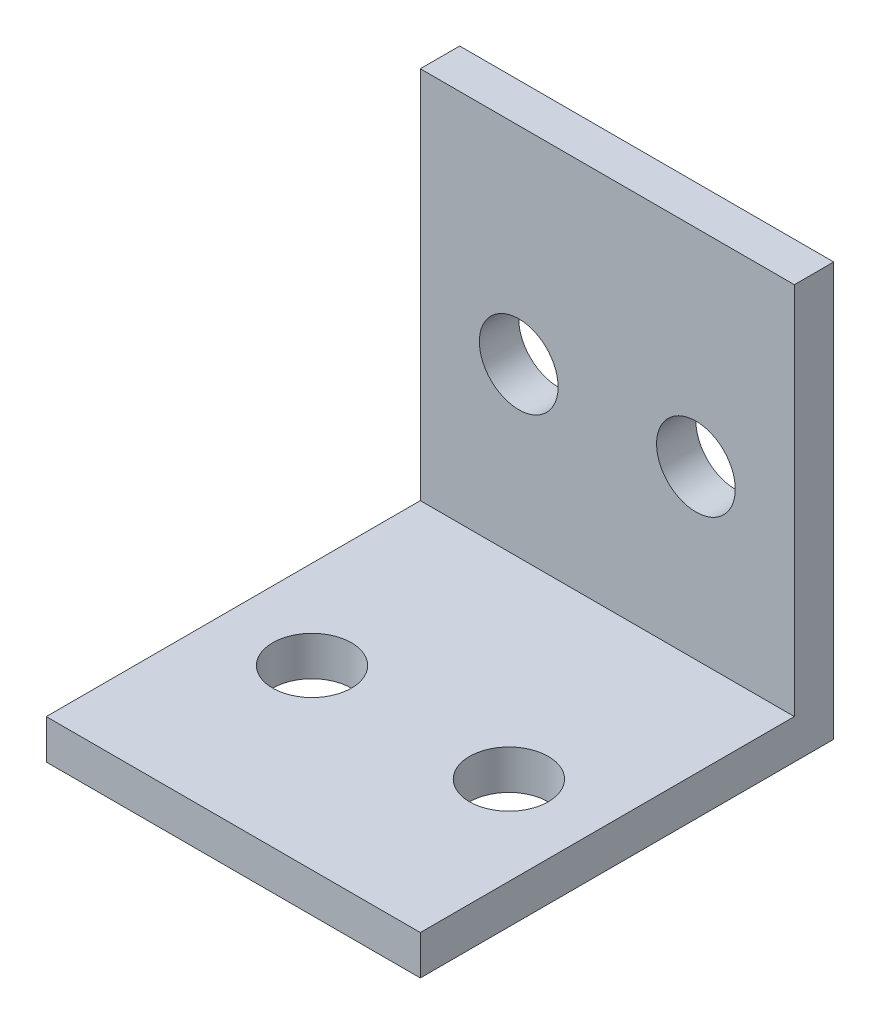
ISO-10303-21;
HEADER;
FILE_DESCRIPTION(('STEP AP214'),'2;1');
FILE_NAME('part.step','',(''),(''),'','','');
FILE_SCHEMA(('AUTOMOTIVE_DESIGN { 1 0 10303 214 1 1 1 1 }'));
ENDSEC;
DATA;
#1=APPLICATION_CONTEXT('core data for automotive mechanical design processes');
#2=APPLICATION_PROTOCOL_DEFINITION('international standard','automotive_design',2000,#1);
#3=PRODUCT_CONTEXT('',#1,'mechanical');
#4=PRODUCT('Part','Part','',(#3));
#5=PRODUCT_RELATED_PRODUCT_CATEGORY('part','',(#4));
#6=PRODUCT_DEFINITION_FORMATION('','',#4);
#7=PRODUCT_DEFINITION_CONTEXT('part definition',#1,'design');
#8=PRODUCT_DEFINITION('design','',#6,#7);
#9=PRODUCT_DEFINITION_SHAPE('','',#8);
#10=(LENGTH_UNIT() NAMED_UNIT(*) SI_UNIT(.MILLI.,.METRE.));
#11=(NAMED_UNIT(*) PLANE_ANGLE_UNIT() SI_UNIT($,.RADIAN.));
#12=(NAMED_UNIT(*) SI_UNIT($,.STERADIAN.) SOLID_ANGLE_UNIT());
#13=UNCERTAINTY_MEASURE_WITH_UNIT(LENGTH_MEASURE(1.E-05),#10,'distance_accuracy_value','');
#14=(GEOMETRIC_REPRESENTATION_CONTEXT(3) GLOBAL_UNCERTAINTY_ASSIGNED_CONTEXT((#13)) GLOBAL_UNIT_ASSIGNED_CONTEXT((#10,
#11,#12)) REPRESENTATION_CONTEXT('',''));
#15=CARTESIAN_POINT('',(0.,0.,0.));
#16=DIRECTION('',(0.,0.,1.));
#17=DIRECTION('',(1.,0.,0.));
#18=AXIS2_PLACEMENT_3D('',#15,#16,#17);
#19=CARTESIAN_POINT('',(9.5,10.5,2.));
#20=DIRECTION('',(-1.,0.,0.));
#21=DIRECTION('',(0.,-1.,0.));
#22=AXIS2_PLACEMENT_3D('',#19,#20,#21);
#23=PLANE('',#22);
#24=DIRECTION('',(0.,1.,0.));
#25=VECTOR('',#24,1.);
#26=CARTESIAN_POINT('',(9.5,10.5,0.));
#27=LINE('',#26,#25);
#28=CARTESIAN_POINT('',(9.5,-10.5,0.));
#29=VERTEX_POINT('',#28);
#30=CARTESIAN_POINT('',(9.5,10.5,0.));
#31=VERTEX_POINT('',#30);
#32=EDGE_CURVE('E104',#29,#31,#27,.T.);
#33=ORIENTED_EDGE('',*,*,#32,.T.);
#34=DIRECTION('',(0.,0.,-1.));
#35=VECTOR('',#34,1.);
#36=CARTESIAN_POINT('',(9.5,10.5,2.));
#37=LINE('',#36,#35);
#38=CARTESIAN_POINT('',(9.5,10.5,2.));
#39=VERTEX_POINT('',#38);
#40=EDGE_CURVE('E11',#39,#31,#37,.T.);
#41=ORIENTED_EDGE('',*,*,#40,.F.);
#42=DIRECTION('',(0.,1.,0.));
#43=VECTOR('',#42,1.);
#44=CARTESIAN_POINT('',(9.5,10.5,2.));
#45=LINE('',#44,#43);
#46=CARTESIAN_POINT('',(9.5,-8.49999999999999,2.));
#47=VERTEX_POINT('',#46);
#48=EDGE_CURVE('E97',#47,#39,#45,.T.);
#49=ORIENTED_EDGE('',*,*,#48,.F.);
#50=DIRECTION('',(0.,0.,-1.));
#51=VECTOR('',#50,1.);
#52=CARTESIAN_POINT('',(9.5,-8.5,21.));
#53=LINE('',#52,#51);
#54=CARTESIAN_POINT('',(9.5,-8.5,21.));
#55=VERTEX_POINT('',#54);
#56=EDGE_CURVE('E114',#55,#47,#53,.T.);
#57=ORIENTED_EDGE('',*,*,#56,.F.);
#58=DIRECTION('',(0.,1.,0.));
#59=VECTOR('',#58,1.);
#60=CARTESIAN_POINT('',(9.5,-8.5,21.));
#61=LINE('',#60,#59);
#62=CARTESIAN_POINT('',(9.5,-10.5,21.));
#63=VERTEX_POINT('',#62);
#64=EDGE_CURVE('E107',#63,#55,#61,.T.);
#65=ORIENTED_EDGE('',*,*,#64,.F.);
#66=DIRECTION('',(0.,0.,-1.));
#67=VECTOR('',#66,1.);
#68=CARTESIAN_POINT('',(9.5,-10.5,2.));
#69=LINE('',#68,#67);
#70=EDGE_CURVE('E89',#63,#29,#69,.T.);
#71=ORIENTED_EDGE('',*,*,#70,.T.);
#72=EDGE_LOOP('',(#33,#41,#49,#57,#65,#71));
#73=FACE_BOUND('',#72,.T.);
#74=ADVANCED_FACE('F43',(#73),#23,.F.);
#75=CARTESIAN_POINT('',(-9.5,10.5,2.));
#76=DIRECTION('',(0.,-1.,0.));
#77=DIRECTION('',(0.,0.,-1.));
#78=AXIS2_PLACEMENT_3D('',#75,#76,#77);
#79=PLANE('',#78);
#80=DIRECTION('',(-1.,0.,0.));
#81=VECTOR('',#80,1.);
#82=CARTESIAN_POINT('',(-9.5,10.5,0.));
#83=LINE('',#82,#81);
#84=CARTESIAN_POINT('',(-9.5,10.5,0.));
#85=VERTEX_POINT('',#84);
#86=EDGE_CURVE('E112',#31,#85,#83,.T.);
#87=ORIENTED_EDGE('',*,*,#86,.T.);
#88=DIRECTION('',(0.,0.,-1.));
#89=VECTOR('',#88,1.);
#90=CARTESIAN_POINT('',(-9.5,10.5,2.));
#91=LINE('',#90,#89);
#92=CARTESIAN_POINT('',(-9.5,10.5,2.));
#93=VERTEX_POINT('',#92);
#94=EDGE_CURVE('E51',#93,#85,#91,.T.);
#95=ORIENTED_EDGE('',*,*,#94,.F.);
#96=DIRECTION('',(-1.,0.,0.));
#97=VECTOR('',#96,1.);
#98=CARTESIAN_POINT('',(-9.5,10.5,2.));
#99=LINE('',#98,#97);
#100=EDGE_CURVE('E64',#39,#93,#99,.T.);
#101=ORIENTED_EDGE('',*,*,#100,.F.);
#102=ORIENTED_EDGE('',*,*,#40,.T.);
#103=EDGE_LOOP('',(#87,#95,#101,#102));
#104=FACE_BOUND('',#103,.T.);
#105=ADVANCED_FACE('F135',(#104),#79,.F.);
#106=CARTESIAN_POINT('',(-9.5,10.5,2.));
#107=DIRECTION('',(1.,0.,0.));
#108=DIRECTION('',(0.,1.,0.));
#109=AXIS2_PLACEMENT_3D('',#106,#107,#108);
#110=PLANE('',#109);
#111=DIRECTION('',(0.,-1.,0.));
#112=VECTOR('',#111,1.);
#113=CARTESIAN_POINT('',(-9.5,10.5,0.));
#114=LINE('',#113,#112);
#115=CARTESIAN_POINT('',(-9.5,-10.5,0.));
#116=VERTEX_POINT('',#115);
#117=EDGE_CURVE('E98',#85,#116,#114,.T.);
#118=ORIENTED_EDGE('',*,*,#117,.T.);
#119=DIRECTION('',(0.,0.,-1.));
#120=VECTOR('',#119,1.);
#121=CARTESIAN_POINT('',(-9.5,-10.5,2.));
#122=LINE('',#121,#120);
#123=CARTESIAN_POINT('',(-9.5,-10.5,21.));
#124=VERTEX_POINT('',#123);
#125=EDGE_CURVE('E92',#124,#116,#122,.T.);
#126=ORIENTED_EDGE('',*,*,#125,.F.);
#127=DIRECTION('',(0.,-1.,0.));
#128=VECTOR('',#127,1.);
#129=CARTESIAN_POINT('',(-9.5,-8.5,21.));
#130=LINE('',#129,#128);
#131=CARTESIAN_POINT('',(-9.5,-8.5,21.));
#132=VERTEX_POINT('',#131);
#133=EDGE_CURVE('E160',#132,#124,#130,.T.);
#134=ORIENTED_EDGE('',*,*,#133,.F.);
#135=DIRECTION('',(0.,0.,-1.));
#136=VECTOR('',#135,1.);
#137=CARTESIAN_POINT('',(-9.5,-8.5,21.));
#138=LINE('',#137,#136);
#139=CARTESIAN_POINT('',(-9.5,-8.5,2.));
#140=VERTEX_POINT('',#139);
#141=EDGE_CURVE('E120',#132,#140,#138,.T.);
#142=ORIENTED_EDGE('',*,*,#141,.T.);
#143=DIRECTION('',(0.,-1.,0.));
#144=VECTOR('',#143,1.);
#145=CARTESIAN_POINT('',(-9.5,10.5,2.));
#146=LINE('',#145,#144);
#147=EDGE_CURVE('E109',#93,#140,#146,.T.);
#148=ORIENTED_EDGE('',*,*,#147,.F.);
#149=ORIENTED_EDGE('',*,*,#94,.T.);
#150=EDGE_LOOP('',(#118,#126,#134,#142,#148,#149));
#151=FACE_BOUND('',#150,.T.);
#152=ADVANCED_FACE('F132',(#151),#110,.F.);
#153=CARTESIAN_POINT('',(-9.5,-10.5,2.));
#154=DIRECTION('',(0.,1.,0.));
#155=DIRECTION('',(0.,0.,1.));
#156=AXIS2_PLACEMENT_3D('',#153,#154,#155);
#157=PLANE('',#156);
#158=CARTESIAN_POINT('',(-5.,-10.5,12.));
#159=DIRECTION('',(0.,1.,0.));
#160=DIRECTION('',(-1.,0.,0.));
#161=AXIS2_PLACEMENT_3D('',#158,#159,#160);
#162=CIRCLE('',#161,2.);
#163=CARTESIAN_POINT('',(-7.,-10.5,12.));
#164=VERTEX_POINT('',#163);
#165=EDGE_CURVE('E179',#164,#164,#162,.T.);
#166=ORIENTED_EDGE('',*,*,#165,.T.);
#167=EDGE_LOOP('',(#166));
#168=FACE_BOUND('',#167,.T.);
#169=CARTESIAN_POINT('',(5.,-10.5,12.));
#170=DIRECTION('',(0.,1.,0.));
#171=DIRECTION('',(1.,0.,0.));
#172=AXIS2_PLACEMENT_3D('',#169,#170,#171);
#173=CIRCLE('',#172,2.);
#174=CARTESIAN_POINT('',(7.,-10.5,12.));
#175=VERTEX_POINT('',#174);
#176=EDGE_CURVE('E190',#175,#175,#173,.T.);
#177=ORIENTED_EDGE('',*,*,#176,.T.);
#178=EDGE_LOOP('',(#177));
#179=FACE_BOUND('',#178,.T.);
#180=DIRECTION('',(1.,0.,0.));
#181=VECTOR('',#180,1.);
#182=CARTESIAN_POINT('',(-9.5,-10.5,0.));
#183=LINE('',#182,#181);
#184=EDGE_CURVE('E84',#116,#29,#183,.T.);
#185=ORIENTED_EDGE('',*,*,#184,.T.);
#186=ORIENTED_EDGE('',*,*,#70,.F.);
#187=DIRECTION('',(1.,0.,0.));
#188=VECTOR('',#187,1.);
#189=CARTESIAN_POINT('',(-9.5,-10.5,21.));
#190=LINE('',#189,#188);
#191=EDGE_CURVE('E155',#124,#63,#190,.T.);
#192=ORIENTED_EDGE('',*,*,#191,.F.);
#193=ORIENTED_EDGE('',*,*,#125,.T.);
#194=EDGE_LOOP('',(#185,#186,#192,#193));
#195=FACE_BOUND('',#194,.T.);
#196=ADVANCED_FACE('F86',(#168,#179,#195),#157,.F.);
#197=CARTESIAN_POINT('',(0.,0.,2.));
#198=DIRECTION('',(0.,0.,1.));
#199=DIRECTION('',(1.,0.,0.));
#200=AXIS2_PLACEMENT_3D('',#197,#198,#199);
#201=PLANE('',#200);
#202=CARTESIAN_POINT('',(4.50000000000001,0.,2.));
#203=DIRECTION('',(0.,0.,1.));
#204=DIRECTION('',(-1.,0.,0.));
#205=AXIS2_PLACEMENT_3D('',#202,#203,#204);
#206=CIRCLE('',#205,2.);
#207=CARTESIAN_POINT('',(2.50000000000001,0.,2.));
#208=VERTEX_POINT('',#207);
#209=EDGE_CURVE('E183',#208,#208,#206,.T.);
#210=ORIENTED_EDGE('',*,*,#209,.F.);
#211=EDGE_LOOP('',(#210));
#212=FACE_BOUND('',#211,.T.);
#213=CARTESIAN_POINT('',(-4.5,0.,2.));
#214=DIRECTION('',(0.,0.,1.));
#215=DIRECTION('',(1.,0.,0.));
#216=AXIS2_PLACEMENT_3D('',#213,#214,#215);
#217=CIRCLE('',#216,2.);
#218=CARTESIAN_POINT('',(-2.5,0.,2.));
#219=VERTEX_POINT('',#218);
#220=EDGE_CURVE('E178',#219,#219,#217,.T.);
#221=ORIENTED_EDGE('',*,*,#220,.F.);
#222=EDGE_LOOP('',(#221));
#223=FACE_BOUND('',#222,.T.);
#224=DIRECTION('',(-1.,0.,0.));
#225=VECTOR('',#224,1.);
#226=CARTESIAN_POINT('',(-9.5,-8.5,2.));
#227=LINE('',#226,#225);
#228=EDGE_CURVE('E58',#47,#140,#227,.T.);
#229=ORIENTED_EDGE('',*,*,#228,.F.);
#230=ORIENTED_EDGE('',*,*,#48,.T.);
#231=ORIENTED_EDGE('',*,*,#100,.T.);
#232=ORIENTED_EDGE('',*,*,#147,.T.);
#233=EDGE_LOOP('',(#229,#230,#231,#232));
#234=FACE_BOUND('',#233,.T.);
#235=ADVANCED_FACE('F164',(#212,#223,#234),#201,.T.);
#236=CARTESIAN_POINT('',(0.,0.,0.));
#237=DIRECTION('',(0.,0.,1.));
#238=DIRECTION('',(1.,0.,0.));
#239=AXIS2_PLACEMENT_3D('',#236,#237,#238);
#240=PLANE('',#239);
#241=CARTESIAN_POINT('',(4.50000000000001,0.,0.));
#242=DIRECTION('',(0.,0.,1.));
#243=DIRECTION('',(-1.,0.,0.));
#244=AXIS2_PLACEMENT_3D('',#241,#242,#243);
#245=CIRCLE('',#244,2.);
#246=CARTESIAN_POINT('',(2.50000000000001,0.,0.));
#247=VERTEX_POINT('',#246);
#248=EDGE_CURVE('E161',#247,#247,#245,.T.);
#249=ORIENTED_EDGE('',*,*,#248,.T.);
#250=EDGE_LOOP('',(#249));
#251=FACE_BOUND('',#250,.T.);
#252=CARTESIAN_POINT('',(-4.5,0.,0.));
#253=DIRECTION('',(0.,0.,1.));
#254=DIRECTION('',(1.,0.,0.));
#255=AXIS2_PLACEMENT_3D('',#252,#253,#254);
#256=CIRCLE('',#255,2.);
#257=CARTESIAN_POINT('',(-2.5,0.,0.));
#258=VERTEX_POINT('',#257);
#259=EDGE_CURVE('E174',#258,#258,#256,.T.);
#260=ORIENTED_EDGE('',*,*,#259,.T.);
#261=EDGE_LOOP('',(#260));
#262=FACE_BOUND('',#261,.T.);
#263=ORIENTED_EDGE('',*,*,#32,.F.);
#264=ORIENTED_EDGE('',*,*,#184,.F.);
#265=ORIENTED_EDGE('',*,*,#117,.F.);
#266=ORIENTED_EDGE('',*,*,#86,.F.);
#267=EDGE_LOOP('',(#263,#264,#265,#266));
#268=FACE_BOUND('',#267,.T.);
#269=ADVANCED_FACE('F111',(#251,#262,#268),#240,.F.);
#270=CARTESIAN_POINT('',(-9.5,-8.5,21.));
#271=DIRECTION('',(0.,-1.,0.));
#272=DIRECTION('',(1.,0.,0.));
#273=AXIS2_PLACEMENT_3D('',#270,#271,#272);
#274=PLANE('',#273);
#275=CARTESIAN_POINT('',(-5.,-8.5,12.));
#276=DIRECTION('',(0.,1.,0.));
#277=DIRECTION('',(-1.,0.,0.));
#278=AXIS2_PLACEMENT_3D('',#275,#276,#277);
#279=CIRCLE('',#278,2.);
#280=CARTESIAN_POINT('',(-7.,-8.5,12.));
#281=VERTEX_POINT('',#280);
#282=EDGE_CURVE('E198',#281,#281,#279,.T.);
#283=ORIENTED_EDGE('',*,*,#282,.F.);
#284=EDGE_LOOP('',(#283));
#285=FACE_BOUND('',#284,.T.);
#286=CARTESIAN_POINT('',(5.,-8.5,12.));
#287=DIRECTION('',(0.,1.,0.));
#288=DIRECTION('',(1.,0.,0.));
#289=AXIS2_PLACEMENT_3D('',#286,#287,#288);
#290=CIRCLE('',#289,2.);
#291=CARTESIAN_POINT('',(7.,-8.5,12.));
#292=VERTEX_POINT('',#291);
#293=EDGE_CURVE('E194',#292,#292,#290,.T.);
#294=ORIENTED_EDGE('',*,*,#293,.F.);
#295=EDGE_LOOP('',(#294));
#296=FACE_BOUND('',#295,.T.);
#297=ORIENTED_EDGE('',*,*,#228,.T.);
#298=ORIENTED_EDGE('',*,*,#141,.F.);
#299=DIRECTION('',(-1.,0.,0.));
#300=VECTOR('',#299,1.);
#301=CARTESIAN_POINT('',(-9.5,-8.5,21.));
#302=LINE('',#301,#300);
#303=EDGE_CURVE('E145',#55,#132,#302,.T.);
#304=ORIENTED_EDGE('',*,*,#303,.F.);
#305=ORIENTED_EDGE('',*,*,#56,.T.);
#306=EDGE_LOOP('',(#297,#298,#304,#305));
#307=FACE_BOUND('',#306,.T.);
#308=ADVANCED_FACE('F141',(#285,#296,#307),#274,.F.);
#309=CARTESIAN_POINT('',(0.,0.,21.));
#310=DIRECTION('',(0.,0.,1.));
#311=DIRECTION('',(1.,0.,0.));
#312=AXIS2_PLACEMENT_3D('',#309,#310,#311);
#313=PLANE('',#312);
#314=ORIENTED_EDGE('',*,*,#133,.T.);
#315=ORIENTED_EDGE('',*,*,#191,.T.);
#316=ORIENTED_EDGE('',*,*,#64,.T.);
#317=ORIENTED_EDGE('',*,*,#303,.T.);
#318=EDGE_LOOP('',(#314,#315,#316,#317));
#319=FACE_BOUND('',#318,.T.);
#320=ADVANCED_FACE('F170',(#319),#313,.T.);
#321=CARTESIAN_POINT('',(-4.5,0.,0.));
#322=DIRECTION('',(0.,0.,1.));
#323=DIRECTION('',(1.,0.,0.));
#324=AXIS2_PLACEMENT_3D('',#321,#322,#323);
#325=CYLINDRICAL_SURFACE('',#324,2.);
#326=ORIENTED_EDGE('',*,*,#259,.F.);
#327=EDGE_LOOP('',(#326));
#328=FACE_BOUND('',#327,.T.);
#329=ORIENTED_EDGE('',*,*,#220,.T.);
#330=EDGE_LOOP('',(#329));
#331=FACE_BOUND('',#330,.T.);
#332=ADVANCED_FACE('F227',(#328,#331),#325,.F.);
#333=CARTESIAN_POINT('',(4.50000000000001,0.,0.));
#334=DIRECTION('',(0.,0.,1.));
#335=DIRECTION('',(1.,0.,0.));
#336=AXIS2_PLACEMENT_3D('',#333,#334,#335);
#337=CYLINDRICAL_SURFACE('',#336,2.);
#338=ORIENTED_EDGE('',*,*,#248,.F.);
#339=EDGE_LOOP('',(#338));
#340=FACE_BOUND('',#339,.T.);
#341=ORIENTED_EDGE('',*,*,#209,.T.);
#342=EDGE_LOOP('',(#341));
#343=FACE_BOUND('',#342,.T.);
#344=ADVANCED_FACE('F221',(#340,#343),#337,.F.);
#345=CARTESIAN_POINT('',(5.,-10.5,12.));
#346=DIRECTION('',(0.,1.,0.));
#347=DIRECTION('',(-1.,0.,0.));
#348=AXIS2_PLACEMENT_3D('',#345,#346,#347);
#349=CYLINDRICAL_SURFACE('',#348,2.);
#350=ORIENTED_EDGE('',*,*,#176,.F.);
#351=EDGE_LOOP('',(#350));
#352=FACE_BOUND('',#351,.T.);
#353=ORIENTED_EDGE('',*,*,#293,.T.);
#354=EDGE_LOOP('',(#353));
#355=FACE_BOUND('',#354,.T.);
#356=ADVANCED_FACE('F211',(#352,#355),#349,.F.);
#357=CARTESIAN_POINT('',(-5.,-10.5,12.));
#358=DIRECTION('',(0.,1.,0.));
#359=DIRECTION('',(-1.,0.,0.));
#360=AXIS2_PLACEMENT_3D('',#357,#358,#359);
#361=CYLINDRICAL_SURFACE('',#360,2.);
#362=ORIENTED_EDGE('',*,*,#165,.F.);
#363=EDGE_LOOP('',(#362));
#364=FACE_BOUND('',#363,.T.);
#365=ORIENTED_EDGE('',*,*,#282,.T.);
#366=EDGE_LOOP('',(#365));
#367=FACE_BOUND('',#366,.T.);
#368=ADVANCED_FACE('F208',(#364,#367),#361,.F.);
#369=CLOSED_SHELL('',(#74,#105,#152,#196,#235,#269,#308,#320,#332,#344,#356,#368));
#370=MANIFOLD_SOLID_BREP('B2',#369);
#371=ADVANCED_BREP_SHAPE_REPRESENTATION('',(#18,#370),#14);
#372=SHAPE_DEFINITION_REPRESENTATION(#9,#371);
ENDSEC;
END-ISO-10303-21;
